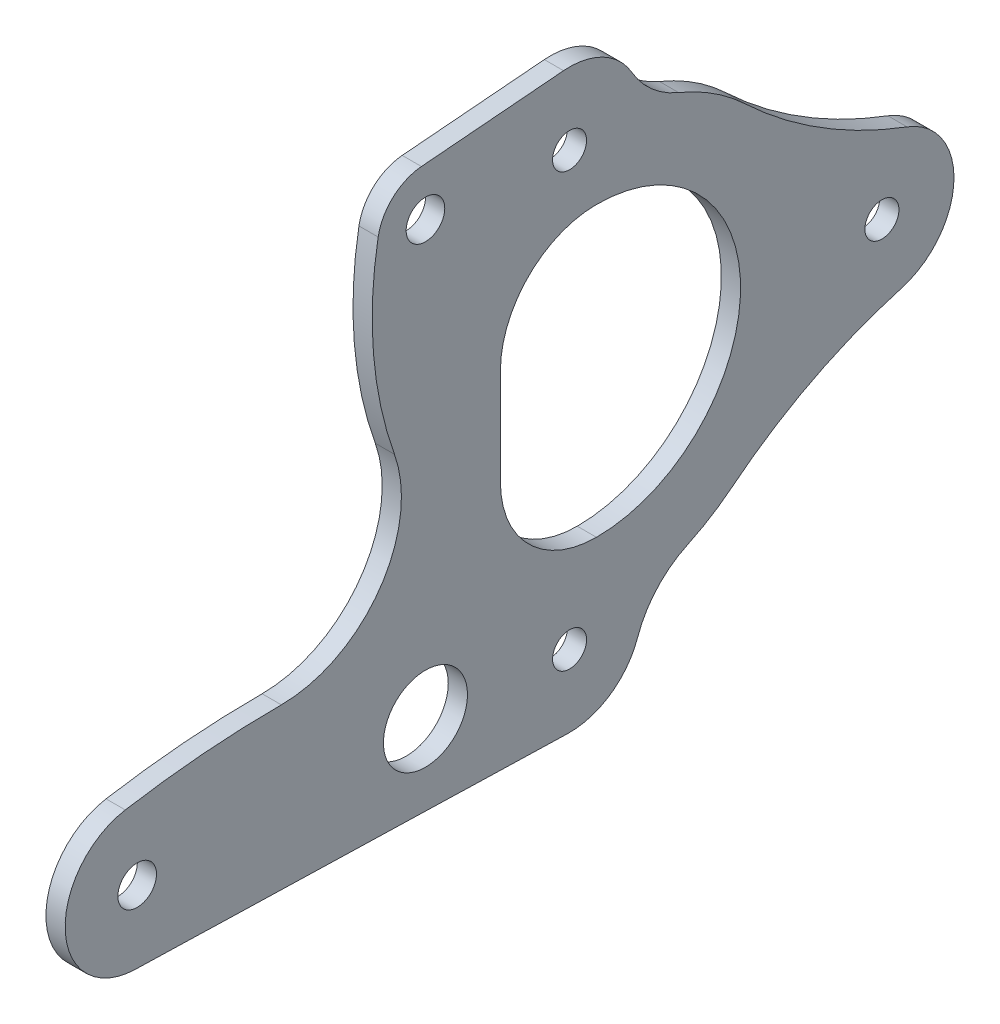
ISO-10303-21;
HEADER;
FILE_DESCRIPTION(('STEP AP214'),'2;1');
FILE_NAME('part.step','',(''),(''),'','','');
FILE_SCHEMA(('AUTOMOTIVE_DESIGN { 1 0 10303 214 1 1 1 1 }'));
ENDSEC;
DATA;
#1=APPLICATION_CONTEXT('core data for automotive mechanical design processes');
#2=APPLICATION_PROTOCOL_DEFINITION('international standard','automotive_design',2000,#1);
#3=PRODUCT_CONTEXT('',#1,'mechanical');
#4=PRODUCT('Part','Part','',(#3));
#5=PRODUCT_RELATED_PRODUCT_CATEGORY('part','',(#4));
#6=PRODUCT_DEFINITION_FORMATION('','',#4);
#7=PRODUCT_DEFINITION_CONTEXT('part definition',#1,'design');
#8=PRODUCT_DEFINITION('design','',#6,#7);
#9=PRODUCT_DEFINITION_SHAPE('','',#8);
#10=(LENGTH_UNIT() NAMED_UNIT(*) SI_UNIT(.MILLI.,.METRE.));
#11=(NAMED_UNIT(*) PLANE_ANGLE_UNIT() SI_UNIT($,.RADIAN.));
#12=(NAMED_UNIT(*) SI_UNIT($,.STERADIAN.) SOLID_ANGLE_UNIT());
#13=UNCERTAINTY_MEASURE_WITH_UNIT(LENGTH_MEASURE(1.E-05),#10,'distance_accuracy_value','');
#14=(GEOMETRIC_REPRESENTATION_CONTEXT(3) GLOBAL_UNCERTAINTY_ASSIGNED_CONTEXT((#13)) GLOBAL_UNIT_ASSIGNED_CONTEXT((#10,
#11,#12)) REPRESENTATION_CONTEXT('',''));
#15=CARTESIAN_POINT('',(0.,0.,0.));
#16=DIRECTION('',(0.,0.,1.));
#17=DIRECTION('',(1.,0.,0.));
#18=AXIS2_PLACEMENT_3D('',#15,#16,#17);
#19=CARTESIAN_POINT('',(2.54,34.6918454316571,2.91131096708449));
#20=DIRECTION('',(0.,0.996497276168665,0.0836252269858301));
#21=DIRECTION('',(0.,-0.0836252269858301,0.996497276168665));
#22=AXIS2_PLACEMENT_3D('',#19,#20,#21);
#23=PLANE('',#22);
#24=DIRECTION('',(0.,0.0836252269858301,-0.996497276168665));
#25=VECTOR('',#24,1.);
#26=CARTESIAN_POINT('',(0.,34.6918454316571,2.91131096708449));
#27=LINE('',#26,#25);
#28=CARTESIAN_POINT('',(0.,36.4902577036732,-18.51897980864));
#29=VERTEX_POINT('',#28);
#30=CARTESIAN_POINT('',(0.,38.0666365555065,-37.30346971296));
#31=VERTEX_POINT('',#30);
#32=EDGE_CURVE('E279',#29,#31,#27,.T.);
#33=ORIENTED_EDGE('',*,*,#32,.F.);
#34=DIRECTION('',(-1.,0.,0.));
#35=VECTOR('',#34,1.);
#36=CARTESIAN_POINT('',(2.54,36.4902577036732,-18.51897980864));
#37=LINE('',#36,#35);
#38=CARTESIAN_POINT('',(2.54,36.4902577036732,-18.51897980864));
#39=VERTEX_POINT('',#38);
#40=EDGE_CURVE('E11',#39,#29,#37,.T.);
#41=ORIENTED_EDGE('',*,*,#40,.F.);
#42=DIRECTION('',(0.,0.0836252269858301,-0.996497276168665));
#43=VECTOR('',#42,1.);
#44=CARTESIAN_POINT('',(2.54,34.6918454316571,2.91131096708449));
#45=LINE('',#44,#43);
#46=CARTESIAN_POINT('',(2.54,38.0666365555065,-37.30346971296));
#47=VERTEX_POINT('',#46);
#48=EDGE_CURVE('E413',#39,#47,#45,.T.);
#49=ORIENTED_EDGE('',*,*,#48,.T.);
#50=DIRECTION('',(-1.,0.,0.));
#51=VECTOR('',#50,1.);
#52=CARTESIAN_POINT('',(2.54,38.0666365555065,-37.30346971296));
#53=LINE('',#52,#51);
#54=EDGE_CURVE('E156',#47,#31,#53,.T.);
#55=ORIENTED_EDGE('',*,*,#54,.T.);
#56=EDGE_LOOP('',(#33,#41,#49,#55));
#57=FACE_BOUND('',#56,.T.);
#58=ADVANCED_FACE('F43',(#57),#23,.T.);
#59=CARTESIAN_POINT('',(2.54,30.1625000000022,-19.0500000000001));
#60=DIRECTION('',(-1.,0.,0.));
#61=DIRECTION('',(0.,0.,1.));
#62=AXIS2_PLACEMENT_3D('',#59,#60,#61);
#63=CYLINDRICAL_SURFACE('',#62,6.34999999999999);
#64=CARTESIAN_POINT('',(0.,30.1625000000022,-19.0500000000001));
#65=DIRECTION('',(1.,0.,0.));
#66=DIRECTION('',(0.,0.,-1.));
#67=AXIS2_PLACEMENT_3D('',#64,#65,#66);
#68=CIRCLE('',#67,6.34999999999999);
#69=CARTESIAN_POINT('',(0.,31.2760569327223,-12.7984009279553));
#70=VERTEX_POINT('',#69);
#71=EDGE_CURVE('E283',#29,#70,#68,.T.);
#72=ORIENTED_EDGE('',*,*,#71,.T.);
#73=DIRECTION('',(-1.,0.,0.));
#74=VECTOR('',#73,1.);
#75=CARTESIAN_POINT('',(2.54,31.2760569327223,-12.7984009279553));
#76=LINE('',#75,#74);
#77=CARTESIAN_POINT('',(2.54,31.2760569327223,-12.7984009279553));
#78=VERTEX_POINT('',#77);
#79=EDGE_CURVE('E54',#78,#70,#76,.T.);
#80=ORIENTED_EDGE('',*,*,#79,.F.);
#81=CARTESIAN_POINT('',(2.54,30.1625000000022,-19.0500000000001));
#82=DIRECTION('',(1.,0.,0.));
#83=DIRECTION('',(0.,0.,-1.));
#84=AXIS2_PLACEMENT_3D('',#81,#82,#83);
#85=CIRCLE('',#84,6.34999999999999);
#86=EDGE_CURVE('E422',#39,#78,#85,.T.);
#87=ORIENTED_EDGE('',*,*,#86,.F.);
#88=ORIENTED_EDGE('',*,*,#40,.T.);
#89=EDGE_LOOP('',(#72,#80,#87,#88));
#90=FACE_BOUND('',#89,.T.);
#91=ADVANCED_FACE('F474',(#90),#63,.T.);
#92=CARTESIAN_POINT('',(2.54,22.3676014709615,-62.8111935043134));
#93=DIRECTION('',(-1.,0.,0.));
#94=DIRECTION('',(0.,0.,1.));
#95=AXIS2_PLACEMENT_3D('',#92,#93,#94);
#96=CYLINDRICAL_SURFACE('',#95,50.8);
#97=CARTESIAN_POINT('',(0.,22.3676014709615,-62.8111935043134));
#98=DIRECTION('',(1.,0.,0.));
#99=DIRECTION('',(0.,0.,-1.));
#100=AXIS2_PLACEMENT_3D('',#97,#98,#99);
#101=CIRCLE('',#100,50.8);
#102=CARTESIAN_POINT('',(0.,5.32561939784772,-14.9550460724561));
#103=VERTEX_POINT('',#102);
#104=EDGE_CURVE('E287',#70,#103,#101,.T.);
#105=ORIENTED_EDGE('',*,*,#104,.T.);
#106=DIRECTION('',(-1.,0.,0.));
#107=VECTOR('',#106,1.);
#108=CARTESIAN_POINT('',(2.54,5.32561939784772,-14.9550460724561));
#109=LINE('',#108,#107);
#110=CARTESIAN_POINT('',(2.54,5.32561939784772,-14.9550460724561));
#111=VERTEX_POINT('',#110);
#112=EDGE_CURVE('E374',#111,#103,#109,.T.);
#113=ORIENTED_EDGE('',*,*,#112,.F.);
#114=CARTESIAN_POINT('',(2.54,22.3676014709615,-62.8111935043134));
#115=DIRECTION('',(1.,0.,0.));
#116=DIRECTION('',(0.,0.,-1.));
#117=AXIS2_PLACEMENT_3D('',#114,#115,#116);
#118=CIRCLE('',#117,50.8);
#119=EDGE_CURVE('E426',#78,#111,#118,.T.);
#120=ORIENTED_EDGE('',*,*,#119,.F.);
#121=ORIENTED_EDGE('',*,*,#79,.T.);
#122=EDGE_LOOP('',(#105,#113,#120,#121));
#123=FACE_BOUND('',#122,.T.);
#124=ADVANCED_FACE('F476',(#123),#96,.T.);
#125=CARTESIAN_POINT('',(2.54,0.,0.));
#126=DIRECTION('',(-1.,0.,0.));
#127=DIRECTION('',(0.,0.,1.));
#128=AXIS2_PLACEMENT_3D('',#125,#126,#127);
#129=CYLINDRICAL_SURFACE('',#128,15.8750000000005);
#130=CARTESIAN_POINT('',(0.,0.,0.));
#131=DIRECTION('',(1.,0.,0.));
#132=DIRECTION('',(0.,0.,-1.));
#133=AXIS2_PLACEMENT_3D('',#130,#131,#132);
#134=CIRCLE('',#133,15.8750000000005);
#135=CARTESIAN_POINT('',(0.,-15.8750000000004,0.));
#136=VERTEX_POINT('',#135);
#137=EDGE_CURVE('E291',#136,#103,#134,.T.);
#138=ORIENTED_EDGE('',*,*,#137,.F.);
#139=DIRECTION('',(-1.,0.,0.));
#140=VECTOR('',#139,1.);
#141=CARTESIAN_POINT('',(2.54,-15.8750000000004,0.));
#142=LINE('',#141,#140);
#143=CARTESIAN_POINT('',(2.54,-15.8750000000004,0.));
#144=VERTEX_POINT('',#143);
#145=EDGE_CURVE('E371',#144,#136,#142,.T.);
#146=ORIENTED_EDGE('',*,*,#145,.F.);
#147=CARTESIAN_POINT('',(2.54,0.,0.));
#148=DIRECTION('',(1.,0.,0.));
#149=DIRECTION('',(0.,0.,-1.));
#150=AXIS2_PLACEMENT_3D('',#147,#148,#149);
#151=CIRCLE('',#150,15.8750000000005);
#152=EDGE_CURVE('E429',#144,#111,#151,.T.);
#153=ORIENTED_EDGE('',*,*,#152,.T.);
#154=ORIENTED_EDGE('',*,*,#112,.T.);
#155=EDGE_LOOP('',(#138,#146,#153,#154));
#156=FACE_BOUND('',#155,.T.);
#157=ADVANCED_FACE('F479',(#156),#129,.F.);
#158=CARTESIAN_POINT('',(2.54,-140.493750000121,4.99340152559924E-12));
#159=DIRECTION('',(-1.,0.,0.));
#160=DIRECTION('',(0.,0.,1.));
#161=AXIS2_PLACEMENT_3D('',#158,#159,#160);
#162=CYLINDRICAL_SURFACE('',#161,124.61875000012);
#163=CARTESIAN_POINT('',(0.,-140.493750000121,4.99340152559924E-12));
#164=DIRECTION('',(1.,0.,0.));
#165=DIRECTION('',(0.,0.,-1.));
#166=AXIS2_PLACEMENT_3D('',#163,#164,#165);
#167=CIRCLE('',#166,124.61875000012);
#168=CARTESIAN_POINT('',(0.,-17.5938793103423,20.6265517241358));
#169=VERTEX_POINT('',#168);
#170=EDGE_CURVE('E295',#136,#169,#167,.T.);
#171=ORIENTED_EDGE('',*,*,#170,.T.);
#172=DIRECTION('',(-1.,0.,0.));
#173=VECTOR('',#172,1.);
#174=CARTESIAN_POINT('',(2.54,-17.5938793103423,20.6265517241358));
#175=LINE('',#174,#173);
#176=CARTESIAN_POINT('',(2.54,-17.5938793103423,20.6265517241358));
#177=VERTEX_POINT('',#176);
#178=EDGE_CURVE('E367',#177,#169,#175,.T.);
#179=ORIENTED_EDGE('',*,*,#178,.F.);
#180=CARTESIAN_POINT('',(2.54,-140.493750000121,4.99340152559924E-12));
#181=DIRECTION('',(1.,0.,0.));
#182=DIRECTION('',(0.,0.,-1.));
#183=AXIS2_PLACEMENT_3D('',#180,#181,#182);
#184=CIRCLE('',#183,124.61875000012);
#185=EDGE_CURVE('E433',#144,#177,#184,.T.);
#186=ORIENTED_EDGE('',*,*,#185,.F.);
#187=ORIENTED_EDGE('',*,*,#145,.T.);
#188=EDGE_LOOP('',(#171,#179,#186,#187));
#189=FACE_BOUND('',#188,.T.);
#190=ADVANCED_FACE('F484',(#189),#162,.T.);
#191=CARTESIAN_POINT('',(2.54,-26.9874999999978,19.0499999999999));
#192=DIRECTION('',(-1.,0.,0.));
#193=DIRECTION('',(0.,0.,1.));
#194=AXIS2_PLACEMENT_3D('',#191,#192,#193);
#195=CYLINDRICAL_SURFACE('',#194,9.52500000000002);
#196=CARTESIAN_POINT('',(0.,-26.9874999999978,19.0499999999999));
#197=DIRECTION('',(1.,0.,0.));
#198=DIRECTION('',(0.,0.,-1.));
#199=AXIS2_PLACEMENT_3D('',#196,#197,#198);
#200=CIRCLE('',#199,9.52500000000002);
#201=CARTESIAN_POINT('',(0.,-36.508827356715,19.3144813154647));
#202=VERTEX_POINT('',#201);
#203=EDGE_CURVE('E299',#169,#202,#200,.T.);
#204=ORIENTED_EDGE('',*,*,#203,.T.);
#205=DIRECTION('',(-1.,0.,0.));
#206=VECTOR('',#205,1.);
#207=CARTESIAN_POINT('',(2.54,-36.508827356715,19.3144813154647));
#208=LINE('',#207,#206);
#209=CARTESIAN_POINT('',(2.54,-36.508827356715,19.3144813154647));
#210=VERTEX_POINT('',#209);
#211=EDGE_CURVE('E363',#210,#202,#208,.T.);
#212=ORIENTED_EDGE('',*,*,#211,.F.);
#213=CARTESIAN_POINT('',(2.54,-26.9874999999978,19.0499999999999));
#214=DIRECTION('',(1.,0.,0.));
#215=DIRECTION('',(0.,0.,-1.));
#216=AXIS2_PLACEMENT_3D('',#213,#214,#215);
#217=CIRCLE('',#216,9.52500000000002);
#218=EDGE_CURVE('E437',#177,#210,#217,.T.);
#219=ORIENTED_EDGE('',*,*,#218,.F.);
#220=ORIENTED_EDGE('',*,*,#178,.T.);
#221=EDGE_LOOP('',(#204,#212,#219,#220));
#222=FACE_BOUND('',#221,.T.);
#223=ADVANCED_FACE('F487',(#222),#195,.T.);
#224=CARTESIAN_POINT('',(2.54,-37.0167783975792,1.0282438443786));
#225=DIRECTION('',(0.,0.999614420652717,-0.027767067240391));
#226=DIRECTION('',(0.,0.027767067240391,0.999614420652717));
#227=AXIS2_PLACEMENT_3D('',#224,#225,#226);
#228=PLANE('',#227);
#229=DIRECTION('',(0.,-0.027767067240391,-0.999614420652717));
#230=VECTOR('',#229,1.);
#231=CARTESIAN_POINT('',(0.,-37.0167783975792,1.0282438443786));
#232=LINE('',#231,#230);
#233=CARTESIAN_POINT('',(0.,-38.0963273567171,-37.8355186845353));
#234=VERTEX_POINT('',#233);
#235=EDGE_CURVE('E303',#202,#234,#232,.T.);
#236=ORIENTED_EDGE('',*,*,#235,.T.);
#237=DIRECTION('',(-1.,0.,0.));
#238=VECTOR('',#237,1.);
#239=CARTESIAN_POINT('',(2.54,-38.0963273567171,-37.8355186845353));
#240=LINE('',#239,#238);
#241=CARTESIAN_POINT('',(2.54,-38.0963273567171,-37.8355186845353));
#242=VERTEX_POINT('',#241);
#243=EDGE_CURVE('E359',#242,#234,#240,.T.);
#244=ORIENTED_EDGE('',*,*,#243,.F.);
#245=DIRECTION('',(0.,-0.027767067240391,-0.999614420652717));
#246=VECTOR('',#245,1.);
#247=CARTESIAN_POINT('',(2.54,-37.0167783975792,1.0282438443786));
#248=LINE('',#247,#246);
#249=EDGE_CURVE('E441',#210,#242,#248,.T.);
#250=ORIENTED_EDGE('',*,*,#249,.F.);
#251=ORIENTED_EDGE('',*,*,#211,.T.);
#252=EDGE_LOOP('',(#236,#244,#250,#251));
#253=FACE_BOUND('',#252,.T.);
#254=ADVANCED_FACE('F489',(#253),#228,.F.);
#255=CARTESIAN_POINT('',(2.54,-28.575,-38.1));
#256=DIRECTION('',(-1.,0.,0.));
#257=DIRECTION('',(0.,0.,1.));
#258=AXIS2_PLACEMENT_3D('',#255,#256,#257);
#259=CYLINDRICAL_SURFACE('',#258,9.52499999999998);
#260=CARTESIAN_POINT('',(0.,-28.575,-38.1));
#261=DIRECTION('',(1.,0.,0.));
#262=DIRECTION('',(0.,0.,-1.));
#263=AXIS2_PLACEMENT_3D('',#260,#261,#262);
#264=CIRCLE('',#263,9.52499999999998);
#265=CARTESIAN_POINT('',(0.,-31.7099252863812,-47.0943242352501));
#266=VERTEX_POINT('',#265);
#267=EDGE_CURVE('E307',#234,#266,#264,.T.);
#268=ORIENTED_EDGE('',*,*,#267,.T.);
#269=DIRECTION('',(-1.,0.,0.));
#270=VECTOR('',#269,1.);
#271=CARTESIAN_POINT('',(2.54,-31.7099252863812,-47.0943242352501));
#272=LINE('',#271,#270);
#273=CARTESIAN_POINT('',(2.54,-31.7099252863812,-47.0943242352501));
#274=VERTEX_POINT('',#273);
#275=EDGE_CURVE('E356',#274,#266,#272,.T.);
#276=ORIENTED_EDGE('',*,*,#275,.F.);
#277=CARTESIAN_POINT('',(2.54,-28.575,-38.1));
#278=DIRECTION('',(1.,0.,0.));
#279=DIRECTION('',(0.,0.,-1.));
#280=AXIS2_PLACEMENT_3D('',#277,#278,#279);
#281=CIRCLE('',#280,9.52499999999998);
#282=EDGE_CURVE('E445',#242,#274,#281,.T.);
#283=ORIENTED_EDGE('',*,*,#282,.F.);
#284=ORIENTED_EDGE('',*,*,#243,.T.);
#285=EDGE_LOOP('',(#268,#276,#283,#284));
#286=FACE_BOUND('',#285,.T.);
#287=ADVANCED_FACE('F494',(#286),#259,.T.);
#288=CARTESIAN_POINT('',(2.54,-35.8898256682227,-59.086756548917));
#289=DIRECTION('',(-1.,0.,0.));
#290=DIRECTION('',(0.,0.,1.));
#291=AXIS2_PLACEMENT_3D('',#288,#289,#290);
#292=CYLINDRICAL_SURFACE('',#291,12.7);
#293=CARTESIAN_POINT('',(0.,-35.8898256682227,-59.086756548917));
#294=DIRECTION('',(1.,0.,0.));
#295=DIRECTION('',(0.,0.,-1.));
#296=AXIS2_PLACEMENT_3D('',#293,#294,#295);
#297=CIRCLE('',#296,12.7);
#298=CARTESIAN_POINT('',(0.,-24.3778793087686,-53.7234468415579));
#299=VERTEX_POINT('',#298);
#300=EDGE_CURVE('E311',#299,#266,#297,.T.);
#301=ORIENTED_EDGE('',*,*,#300,.F.);
#302=DIRECTION('',(-1.,0.,0.));
#303=VECTOR('',#302,1.);
#304=CARTESIAN_POINT('',(2.54,-24.3778793087686,-53.7234468415579));
#305=LINE('',#304,#303);
#306=CARTESIAN_POINT('',(2.54,-24.3778793087686,-53.7234468415579));
#307=VERTEX_POINT('',#306);
#308=EDGE_CURVE('E353',#307,#299,#305,.T.);
#309=ORIENTED_EDGE('',*,*,#308,.F.);
#310=CARTESIAN_POINT('',(2.54,-35.8898256682227,-59.086756548917));
#311=DIRECTION('',(1.,0.,0.));
#312=DIRECTION('',(0.,0.,-1.));
#313=AXIS2_PLACEMENT_3D('',#310,#311,#312);
#314=CIRCLE('',#313,12.7);
#315=EDGE_CURVE('E448',#307,#274,#314,.T.);
#316=ORIENTED_EDGE('',*,*,#315,.T.);
#317=ORIENTED_EDGE('',*,*,#275,.T.);
#318=EDGE_LOOP('',(#301,#309,#316,#317));
#319=FACE_BOUND('',#318,.T.);
#320=ADVANCED_FACE('F497',(#319),#292,.F.);
#321=CARTESIAN_POINT('',(2.54,1.5240000000031,-41.6560000000001));
#322=DIRECTION('',(-1.,0.,0.));
#323=DIRECTION('',(0.,0.,1.));
#324=AXIS2_PLACEMENT_3D('',#321,#322,#323);
#325=CYLINDRICAL_SURFACE('',#324,28.575);
#326=CARTESIAN_POINT('',(0.,1.5240000000031,-41.6560000000001));
#327=DIRECTION('',(1.,0.,0.));
#328=DIRECTION('',(0.,0.,-1.));
#329=AXIS2_PLACEMENT_3D('',#326,#327,#328);
#330=CIRCLE('',#329,28.575);
#331=CARTESIAN_POINT('',(0.,-20.7503137231824,-59.5553176730599));
#332=VERTEX_POINT('',#331);
#333=EDGE_CURVE('E315',#299,#332,#330,.T.);
#334=ORIENTED_EDGE('',*,*,#333,.T.);
#335=DIRECTION('',(-1.,0.,0.));
#336=VECTOR('',#335,1.);
#337=CARTESIAN_POINT('',(2.54,-20.7503137231824,-59.5553176730599));
#338=LINE('',#337,#336);
#339=CARTESIAN_POINT('',(2.54,-20.7503137231824,-59.5553176730599));
#340=VERTEX_POINT('',#339);
#341=EDGE_CURVE('E350',#340,#332,#338,.T.);
#342=ORIENTED_EDGE('',*,*,#341,.F.);
#343=CARTESIAN_POINT('',(2.54,1.5240000000031,-41.6560000000001));
#344=DIRECTION('',(1.,0.,0.));
#345=DIRECTION('',(0.,0.,-1.));
#346=AXIS2_PLACEMENT_3D('',#343,#344,#345);
#347=CIRCLE('',#346,28.575);
#348=EDGE_CURVE('E452',#307,#340,#347,.T.);
#349=ORIENTED_EDGE('',*,*,#348,.F.);
#350=ORIENTED_EDGE('',*,*,#308,.T.);
#351=EDGE_LOOP('',(#334,#342,#349,#350));
#352=FACE_BOUND('',#351,.T.);
#353=ADVANCED_FACE('F502',(#352),#325,.T.);
#354=CARTESIAN_POINT('',(2.54,-70.2487886635945,-99.3315791687485));
#355=DIRECTION('',(-1.,0.,0.));
#356=DIRECTION('',(0.,0.,1.));
#357=AXIS2_PLACEMENT_3D('',#354,#355,#356);
#358=CYLINDRICAL_SURFACE('',#357,63.5);
#359=CARTESIAN_POINT('',(0.,-70.2487886635945,-99.3315791687485));
#360=DIRECTION('',(1.,0.,0.));
#361=DIRECTION('',(0.,0.,-1.));
#362=AXIS2_PLACEMENT_3D('',#359,#360,#361);
#363=CIRCLE('',#362,63.5);
#364=CARTESIAN_POINT('',(0.,-9.16288547786013,-81.9890755437497));
#365=VERTEX_POINT('',#364);
#366=EDGE_CURVE('E319',#365,#332,#363,.T.);
#367=ORIENTED_EDGE('',*,*,#366,.F.);
#368=DIRECTION('',(-1.,0.,0.));
#369=VECTOR('',#368,1.);
#370=CARTESIAN_POINT('',(2.54,-9.16288547786013,-81.9890755437497));
#371=LINE('',#370,#369);
#372=CARTESIAN_POINT('',(2.54,-9.16288547786013,-81.9890755437497));
#373=VERTEX_POINT('',#372);
#374=EDGE_CURVE('E347',#373,#365,#371,.T.);
#375=ORIENTED_EDGE('',*,*,#374,.F.);
#376=CARTESIAN_POINT('',(2.54,-70.2487886635945,-99.3315791687485));
#377=DIRECTION('',(1.,0.,0.));
#378=DIRECTION('',(0.,0.,-1.));
#379=AXIS2_PLACEMENT_3D('',#376,#377,#378);
#380=CIRCLE('',#379,63.5);
#381=EDGE_CURVE('E455',#373,#340,#380,.T.);
#382=ORIENTED_EDGE('',*,*,#381,.T.);
#383=ORIENTED_EDGE('',*,*,#341,.T.);
#384=EDGE_LOOP('',(#367,#375,#382,#383));
#385=FACE_BOUND('',#384,.T.);
#386=ADVANCED_FACE('F507',(#385),#358,.F.);
#387=CARTESIAN_POINT('',(2.54,0.,-79.3876999999999));
#388=DIRECTION('',(-1.,0.,0.));
#389=DIRECTION('',(0.,0.,1.));
#390=AXIS2_PLACEMENT_3D('',#387,#388,#389);
#391=CYLINDRICAL_SURFACE('',#390,9.52499999999997);
#392=CARTESIAN_POINT('',(0.,0.,-79.3876999999999));
#393=DIRECTION('',(1.,0.,0.));
#394=DIRECTION('',(0.,0.,-1.));
#395=AXIS2_PLACEMENT_3D('',#392,#393,#394);
#396=CIRCLE('',#395,9.52499999999997);
#397=CARTESIAN_POINT('',(0.,8.92323858671863,-82.7195820694158));
#398=VERTEX_POINT('',#397);
#399=EDGE_CURVE('E323',#365,#398,#396,.T.);
#400=ORIENTED_EDGE('',*,*,#399,.T.);
#401=DIRECTION('',(-1.,0.,0.));
#402=VECTOR('',#401,1.);
#403=CARTESIAN_POINT('',(2.54,8.92323858671863,-82.7195820694158));
#404=LINE('',#403,#402);
#405=CARTESIAN_POINT('',(2.54,8.92323858671863,-82.7195820694158));
#406=VERTEX_POINT('',#405);
#407=EDGE_CURVE('E344',#406,#398,#404,.T.);
#408=ORIENTED_EDGE('',*,*,#407,.F.);
#409=CARTESIAN_POINT('',(2.54,0.,-79.3876999999999));
#410=DIRECTION('',(1.,0.,0.));
#411=DIRECTION('',(0.,0.,-1.));
#412=AXIS2_PLACEMENT_3D('',#409,#410,#411);
#413=CIRCLE('',#412,9.52499999999997);
#414=EDGE_CURVE('E459',#373,#406,#413,.T.);
#415=ORIENTED_EDGE('',*,*,#414,.F.);
#416=ORIENTED_EDGE('',*,*,#374,.T.);
#417=EDGE_LOOP('',(#400,#408,#415,#416));
#418=FACE_BOUND('',#417,.T.);
#419=ADVANCED_FACE('F509',(#418),#391,.T.);
#420=CARTESIAN_POINT('',(2.54,68.4114958315097,-104.932129198855));
#421=DIRECTION('',(-1.,0.,0.));
#422=DIRECTION('',(0.,0.,1.));
#423=AXIS2_PLACEMENT_3D('',#420,#421,#422);
#424=CYLINDRICAL_SURFACE('',#423,63.5);
#425=CARTESIAN_POINT('',(0.,68.4114958315097,-104.932129198855));
#426=DIRECTION('',(1.,0.,0.));
#427=DIRECTION('',(0.,0.,-1.));
#428=AXIS2_PLACEMENT_3D('',#425,#426,#427);
#429=CIRCLE('',#428,63.5);
#430=CARTESIAN_POINT('',(0.,22.2821883615052,-61.2934194065412));
#431=VERTEX_POINT('',#430);
#432=EDGE_CURVE('E327',#431,#398,#429,.T.);
#433=ORIENTED_EDGE('',*,*,#432,.F.);
#434=DIRECTION('',(-1.,0.,0.));
#435=VECTOR('',#434,1.);
#436=CARTESIAN_POINT('',(2.54,22.2821883615052,-61.2934194065412));
#437=LINE('',#436,#435);
#438=CARTESIAN_POINT('',(2.54,22.2821883615052,-61.2934194065412));
#439=VERTEX_POINT('',#438);
#440=EDGE_CURVE('E250',#439,#431,#437,.T.);
#441=ORIENTED_EDGE('',*,*,#440,.F.);
#442=CARTESIAN_POINT('',(2.54,68.4114958315097,-104.932129198855));
#443=DIRECTION('',(1.,0.,0.));
#444=DIRECTION('',(0.,0.,-1.));
#445=AXIS2_PLACEMENT_3D('',#442,#443,#444);
#446=CIRCLE('',#445,63.5);
#447=EDGE_CURVE('E237',#439,#406,#446,.T.);
#448=ORIENTED_EDGE('',*,*,#447,.T.);
#449=ORIENTED_EDGE('',*,*,#407,.T.);
#450=EDGE_LOOP('',(#433,#441,#448,#449));
#451=FACE_BOUND('',#450,.T.);
#452=ADVANCED_FACE('F464',(#451),#424,.F.);
#453=CARTESIAN_POINT('',(2.54,1.5240000000031,-41.6560000000001));
#454=DIRECTION('',(-1.,0.,0.));
#455=DIRECTION('',(0.,0.,1.));
#456=AXIS2_PLACEMENT_3D('',#453,#454,#455);
#457=CYLINDRICAL_SURFACE('',#456,28.575);
#458=CARTESIAN_POINT('',(0.,1.5240000000031,-41.6560000000001));
#459=DIRECTION('',(1.,0.,0.));
#460=DIRECTION('',(0.,0.,-1.));
#461=AXIS2_PLACEMENT_3D('',#458,#459,#460);
#462=CIRCLE('',#461,28.575);
#463=CARTESIAN_POINT('',(0.,27.9562113626633,-52.5127411077017));
#464=VERTEX_POINT('',#463);
#465=EDGE_CURVE('E245',#431,#464,#462,.T.);
#466=ORIENTED_EDGE('',*,*,#465,.T.);
#467=DIRECTION('',(-1.,0.,0.));
#468=VECTOR('',#467,1.);
#469=CARTESIAN_POINT('',(2.54,27.9562113626633,-52.5127411077017));
#470=LINE('',#469,#468);
#471=CARTESIAN_POINT('',(2.54,27.9562113626633,-52.5127411077017));
#472=VERTEX_POINT('',#471);
#473=EDGE_CURVE('E242',#472,#464,#470,.T.);
#474=ORIENTED_EDGE('',*,*,#473,.F.);
#475=CARTESIAN_POINT('',(2.54,1.5240000000031,-41.6560000000001));
#476=DIRECTION('',(1.,0.,0.));
#477=DIRECTION('',(0.,0.,-1.));
#478=AXIS2_PLACEMENT_3D('',#475,#476,#477);
#479=CIRCLE('',#478,28.575);
#480=EDGE_CURVE('E231',#439,#472,#479,.T.);
#481=ORIENTED_EDGE('',*,*,#480,.F.);
#482=ORIENTED_EDGE('',*,*,#440,.T.);
#483=EDGE_LOOP('',(#466,#474,#481,#482));
#484=FACE_BOUND('',#483,.T.);
#485=ADVANCED_FACE('F243',(#484),#457,.T.);
#486=CARTESIAN_POINT('',(2.54,39.7038608571789,-57.3379593777913));
#487=DIRECTION('',(-1.,0.,0.));
#488=DIRECTION('',(0.,0.,1.));
#489=AXIS2_PLACEMENT_3D('',#486,#487,#488);
#490=CYLINDRICAL_SURFACE('',#489,12.7);
#491=CARTESIAN_POINT('',(0.,39.7038608571789,-57.3379593777913));
#492=DIRECTION('',(1.,0.,0.));
#493=DIRECTION('',(0.,0.,-1.));
#494=AXIS2_PLACEMENT_3D('',#491,#492,#493);
#495=CIRCLE('',#494,12.7);
#496=CARTESIAN_POINT('',(0.,33.3445117959338,-46.3448397333391));
#497=VERTEX_POINT('',#496);
#498=EDGE_CURVE('E333',#497,#464,#495,.T.);
#499=ORIENTED_EDGE('',*,*,#498,.F.);
#500=DIRECTION('',(-1.,0.,0.));
#501=VECTOR('',#500,1.);
#502=CARTESIAN_POINT('',(2.54,33.3445117959338,-46.3448397333391));
#503=LINE('',#502,#501);
#504=CARTESIAN_POINT('',(2.54,33.3445117959338,-46.3448397333391));
#505=VERTEX_POINT('',#504);
#506=EDGE_CURVE('E149',#505,#497,#503,.T.);
#507=ORIENTED_EDGE('',*,*,#506,.F.);
#508=CARTESIAN_POINT('',(2.54,39.7038608571789,-57.3379593777913));
#509=DIRECTION('',(1.,0.,0.));
#510=DIRECTION('',(0.,0.,-1.));
#511=AXIS2_PLACEMENT_3D('',#508,#509,#510);
#512=CIRCLE('',#511,12.7);
#513=EDGE_CURVE('E235',#505,#472,#512,.T.);
#514=ORIENTED_EDGE('',*,*,#513,.T.);
#515=ORIENTED_EDGE('',*,*,#473,.T.);
#516=EDGE_LOOP('',(#499,#507,#514,#515));
#517=FACE_BOUND('',#516,.T.);
#518=ADVANCED_FACE('F252',(#517),#490,.F.);
#519=CARTESIAN_POINT('',(2.54,1.5240000000031,-41.6560000000001));
#520=DIRECTION('',(-1.,0.,0.));
#521=DIRECTION('',(0.,0.,1.));
#522=AXIS2_PLACEMENT_3D('',#519,#520,#521);
#523=CYLINDRICAL_SURFACE('',#522,19.05);
#524=CARTESIAN_POINT('',(0.,1.5240000000031,-41.6560000000001));
#525=DIRECTION('',(1.,0.,0.));
#526=DIRECTION('',(0.,0.,-1.));
#527=AXIS2_PLACEMENT_3D('',#524,#525,#526);
#528=CIRCLE('',#527,19.05);
#529=CARTESIAN_POINT('',(0.,-17.5259999999969,-41.6560000000001));
#530=VERTEX_POINT('',#529);
#531=CARTESIAN_POINT('',(0.,20.5740000000031,-41.6560000000001));
#532=VERTEX_POINT('',#531);
#533=EDGE_CURVE('E262',#530,#532,#528,.T.);
#534=ORIENTED_EDGE('',*,*,#533,.F.);
#535=DIRECTION('',(-1.,0.,0.));
#536=VECTOR('',#535,1.);
#537=CARTESIAN_POINT('',(2.54,-17.5259999999969,-41.6560000000001));
#538=LINE('',#537,#536);
#539=CARTESIAN_POINT('',(2.54,-17.5259999999969,-41.6560000000001));
#540=VERTEX_POINT('',#539);
#541=EDGE_CURVE('E47',#540,#530,#538,.T.);
#542=ORIENTED_EDGE('',*,*,#541,.F.);
#543=CARTESIAN_POINT('',(2.54,1.5240000000031,-41.6560000000001));
#544=DIRECTION('',(1.,0.,0.));
#545=DIRECTION('',(0.,0.,-1.));
#546=AXIS2_PLACEMENT_3D('',#543,#544,#545);
#547=CIRCLE('',#546,19.05);
#548=CARTESIAN_POINT('',(2.54,20.5740000000031,-41.6560000000001));
#549=VERTEX_POINT('',#548);
#550=EDGE_CURVE('E338',#540,#549,#547,.T.);
#551=ORIENTED_EDGE('',*,*,#550,.T.);
#552=DIRECTION('',(-1.,0.,0.));
#553=VECTOR('',#552,1.);
#554=CARTESIAN_POINT('',(2.54,20.5740000000031,-41.6560000000001));
#555=LINE('',#554,#553);
#556=EDGE_CURVE('E258',#549,#532,#555,.T.);
#557=ORIENTED_EDGE('',*,*,#556,.T.);
#558=EDGE_LOOP('',(#534,#542,#551,#557));
#559=FACE_BOUND('',#558,.T.);
#560=ADVANCED_FACE('F45',(#559),#523,.F.);
#561=CARTESIAN_POINT('',(2.54,-4.82599999999691,-41.6560000000001));
#562=DIRECTION('',(-1.,0.,0.));
#563=DIRECTION('',(0.,0.,1.));
#564=AXIS2_PLACEMENT_3D('',#561,#562,#563);
#565=CYLINDRICAL_SURFACE('',#564,12.7);
#566=CARTESIAN_POINT('',(0.,-4.82599999999691,-41.6560000000001));
#567=DIRECTION('',(1.,0.,0.));
#568=DIRECTION('',(0.,0.,-1.));
#569=AXIS2_PLACEMENT_3D('',#566,#567,#568);
#570=CIRCLE('',#569,12.7);
#571=CARTESIAN_POINT('',(0.,-4.82599999999691,-28.9560000000001));
#572=VERTEX_POINT('',#571);
#573=EDGE_CURVE('E266',#530,#572,#570,.F.);
#574=ORIENTED_EDGE('',*,*,#573,.T.);
#575=DIRECTION('',(-1.,0.,0.));
#576=VECTOR('',#575,1.);
#577=CARTESIAN_POINT('',(2.54,-4.82599999999691,-28.9560000000001));
#578=LINE('',#577,#576);
#579=CARTESIAN_POINT('',(2.54,-4.82599999999691,-28.9560000000001));
#580=VERTEX_POINT('',#579);
#581=EDGE_CURVE('E384',#580,#572,#578,.T.);
#582=ORIENTED_EDGE('',*,*,#581,.F.);
#583=CARTESIAN_POINT('',(2.54,-4.82599999999691,-41.6560000000001));
#584=DIRECTION('',(1.,0.,0.));
#585=DIRECTION('',(0.,0.,-1.));
#586=AXIS2_PLACEMENT_3D('',#583,#584,#585);
#587=CIRCLE('',#586,12.7);
#588=EDGE_CURVE('E397',#540,#580,#587,.F.);
#589=ORIENTED_EDGE('',*,*,#588,.F.);
#590=ORIENTED_EDGE('',*,*,#541,.T.);
#591=EDGE_LOOP('',(#574,#582,#589,#590));
#592=FACE_BOUND('',#591,.T.);
#593=ADVANCED_FACE('F396',(#592),#565,.F.);
#594=CARTESIAN_POINT('',(2.54,0.,-28.9560000000001));
#595=DIRECTION('',(0.,0.,-1.));
#596=DIRECTION('',(0.,1.,0.));
#597=AXIS2_PLACEMENT_3D('',#594,#595,#596);
#598=PLANE('',#597);
#599=DIRECTION('',(0.,-1.,0.));
#600=VECTOR('',#599,1.);
#601=CARTESIAN_POINT('',(0.,0.,-28.9560000000001));
#602=LINE('',#601,#600);
#603=CARTESIAN_POINT('',(0.,7.8740000000031,-28.9560000000001));
#604=VERTEX_POINT('',#603);
#605=EDGE_CURVE('E271',#604,#572,#602,.T.);
#606=ORIENTED_EDGE('',*,*,#605,.F.);
#607=DIRECTION('',(-1.,0.,0.));
#608=VECTOR('',#607,1.);
#609=CARTESIAN_POINT('',(2.54,7.8740000000031,-28.9560000000001));
#610=LINE('',#609,#608);
#611=CARTESIAN_POINT('',(2.54,7.8740000000031,-28.9560000000001));
#612=VERTEX_POINT('',#611);
#613=EDGE_CURVE('E382',#612,#604,#610,.T.);
#614=ORIENTED_EDGE('',*,*,#613,.F.);
#615=DIRECTION('',(0.,-1.,0.));
#616=VECTOR('',#615,1.);
#617=CARTESIAN_POINT('',(2.54,0.,-28.9560000000001));
#618=LINE('',#617,#616);
#619=EDGE_CURVE('E409',#612,#580,#618,.T.);
#620=ORIENTED_EDGE('',*,*,#619,.T.);
#621=ORIENTED_EDGE('',*,*,#581,.T.);
#622=EDGE_LOOP('',(#606,#614,#620,#621));
#623=FACE_BOUND('',#622,.T.);
#624=ADVANCED_FACE('F407',(#623),#598,.T.);
#625=CARTESIAN_POINT('',(2.54,7.8740000000031,-41.6560000000001));
#626=DIRECTION('',(-1.,0.,0.));
#627=DIRECTION('',(0.,0.,1.));
#628=AXIS2_PLACEMENT_3D('',#625,#626,#627);
#629=CYLINDRICAL_SURFACE('',#628,12.7);
#630=CARTESIAN_POINT('',(0.,7.8740000000031,-41.6560000000001));
#631=DIRECTION('',(1.,0.,0.));
#632=DIRECTION('',(0.,0.,-1.));
#633=AXIS2_PLACEMENT_3D('',#630,#631,#632);
#634=CIRCLE('',#633,12.7);
#635=EDGE_CURVE('E275',#604,#532,#634,.F.);
#636=ORIENTED_EDGE('',*,*,#635,.T.);
#637=ORIENTED_EDGE('',*,*,#556,.F.);
#638=CARTESIAN_POINT('',(2.54,7.8740000000031,-41.6560000000001));
#639=DIRECTION('',(1.,0.,0.));
#640=DIRECTION('',(0.,0.,-1.));
#641=AXIS2_PLACEMENT_3D('',#638,#639,#640);
#642=CIRCLE('',#641,12.7);
#643=EDGE_CURVE('E410',#612,#549,#642,.F.);
#644=ORIENTED_EDGE('',*,*,#643,.F.);
#645=ORIENTED_EDGE('',*,*,#613,.T.);
#646=EDGE_LOOP('',(#636,#637,#644,#645));
#647=FACE_BOUND('',#646,.T.);
#648=ADVANCED_FACE('F406',(#647),#629,.F.);
#649=CARTESIAN_POINT('',(2.54,28.575,-38.1));
#650=DIRECTION('',(-1.,0.,0.));
#651=DIRECTION('',(0.,0.,1.));
#652=AXIS2_PLACEMENT_3D('',#649,#650,#651);
#653=CYLINDRICAL_SURFACE('',#652,9.52499999999999);
#654=CARTESIAN_POINT('',(0.,28.575,-38.1));
#655=DIRECTION('',(1.,0.,0.));
#656=DIRECTION('',(0.,0.,-1.));
#657=AXIS2_PLACEMENT_3D('',#654,#655,#656);
#658=CIRCLE('',#657,9.52499999999999);
#659=EDGE_CURVE('E335',#497,#31,#658,.T.);
#660=ORIENTED_EDGE('',*,*,#659,.T.);
#661=ORIENTED_EDGE('',*,*,#54,.F.);
#662=CARTESIAN_POINT('',(2.54,28.575,-38.1));
#663=DIRECTION('',(1.,0.,0.));
#664=DIRECTION('',(0.,0.,-1.));
#665=AXIS2_PLACEMENT_3D('',#662,#663,#664);
#666=CIRCLE('',#665,9.52499999999999);
#667=EDGE_CURVE('E66',#505,#47,#666,.T.);
#668=ORIENTED_EDGE('',*,*,#667,.F.);
#669=ORIENTED_EDGE('',*,*,#506,.T.);
#670=EDGE_LOOP('',(#660,#661,#668,#669));
#671=FACE_BOUND('',#670,.T.);
#672=ADVANCED_FACE('F468',(#671),#653,.T.);
#673=CARTESIAN_POINT('',(2.54,0.,0.));
#674=DIRECTION('',(1.,0.,0.));
#675=DIRECTION('',(0.,0.,-1.));
#676=AXIS2_PLACEMENT_3D('',#673,#674,#675);
#677=PLANE('',#676);
#678=CARTESIAN_POINT('',(2.54,-26.9874999999978,19.0499999999999));
#679=DIRECTION('',(1.,0.,0.));
#680=DIRECTION('',(0.,0.,-1.));
#681=AXIS2_PLACEMENT_3D('',#678,#679,#680);
#682=CIRCLE('',#681,2.5527);
#683=CARTESIAN_POINT('',(2.54,-26.9874999999978,16.4972999999999));
#684=VERTEX_POINT('',#683);
#685=EDGE_CURVE('E581',#684,#684,#682,.T.);
#686=ORIENTED_EDGE('',*,*,#685,.F.);
#687=EDGE_LOOP('',(#686));
#688=FACE_BOUND('',#687,.T.);
#689=CARTESIAN_POINT('',(2.54,30.1625000000022,-19.0500000000001));
#690=DIRECTION('',(1.,0.,0.));
#691=DIRECTION('',(0.,0.,-1.));
#692=AXIS2_PLACEMENT_3D('',#689,#690,#691);
#693=CIRCLE('',#692,2.5527);
#694=CARTESIAN_POINT('',(2.54,30.1625000000022,-21.6027000000001));
#695=VERTEX_POINT('',#694);
#696=EDGE_CURVE('E585',#695,#695,#693,.T.);
#697=ORIENTED_EDGE('',*,*,#696,.F.);
#698=EDGE_LOOP('',(#697));
#699=FACE_BOUND('',#698,.T.);
#700=CARTESIAN_POINT('',(2.54,-28.575,-38.1));
#701=DIRECTION('',(1.,0.,0.));
#702=DIRECTION('',(0.,0.,-1.));
#703=AXIS2_PLACEMENT_3D('',#700,#701,#702);
#704=CIRCLE('',#703,2.24789999999999);
#705=CARTESIAN_POINT('',(2.54,-28.575,-40.3479));
#706=VERTEX_POINT('',#705);
#707=EDGE_CURVE('E595',#706,#706,#704,.T.);
#708=ORIENTED_EDGE('',*,*,#707,.F.);
#709=EDGE_LOOP('',(#708));
#710=FACE_BOUND('',#709,.T.);
#711=CARTESIAN_POINT('',(2.54,0.,-79.3876999999999));
#712=DIRECTION('',(1.,0.,0.));
#713=DIRECTION('',(0.,0.,-1.));
#714=AXIS2_PLACEMENT_3D('',#711,#712,#713);
#715=CIRCLE('',#714,2.24789999999999);
#716=CARTESIAN_POINT('',(2.54,0.,-81.6355999999999));
#717=VERTEX_POINT('',#716);
#718=EDGE_CURVE('E603',#717,#717,#715,.T.);
#719=ORIENTED_EDGE('',*,*,#718,.F.);
#720=EDGE_LOOP('',(#719));
#721=FACE_BOUND('',#720,.T.);
#722=CARTESIAN_POINT('',(2.54,28.575,-38.1));
#723=DIRECTION('',(1.,0.,0.));
#724=DIRECTION('',(0.,0.,-1.));
#725=AXIS2_PLACEMENT_3D('',#722,#723,#724);
#726=CIRCLE('',#725,2.24789999999999);
#727=CARTESIAN_POINT('',(2.54,28.575,-40.3479));
#728=VERTEX_POINT('',#727);
#729=EDGE_CURVE('E611',#728,#728,#726,.T.);
#730=ORIENTED_EDGE('',*,*,#729,.F.);
#731=EDGE_LOOP('',(#730));
#732=FACE_BOUND('',#731,.T.);
#733=CARTESIAN_POINT('',(2.54,-26.9874999999978,-19.0500000000001));
#734=DIRECTION('',(1.,0.,0.));
#735=DIRECTION('',(0.,0.,-1.));
#736=AXIS2_PLACEMENT_3D('',#733,#734,#735);
#737=CIRCLE('',#736,5.55625);
#738=CARTESIAN_POINT('',(2.54,-26.9874999999978,-24.6062500000001));
#739=VERTEX_POINT('',#738);
#740=EDGE_CURVE('E619',#739,#739,#737,.T.);
#741=ORIENTED_EDGE('',*,*,#740,.F.);
#742=EDGE_LOOP('',(#741));
#743=FACE_BOUND('',#742,.T.);
#744=ORIENTED_EDGE('',*,*,#550,.F.);
#745=ORIENTED_EDGE('',*,*,#588,.T.);
#746=ORIENTED_EDGE('',*,*,#619,.F.);
#747=ORIENTED_EDGE('',*,*,#643,.T.);
#748=EDGE_LOOP('',(#744,#745,#746,#747));
#749=FACE_BOUND('',#748,.T.);
#750=ORIENTED_EDGE('',*,*,#48,.F.);
#751=ORIENTED_EDGE('',*,*,#86,.T.);
#752=ORIENTED_EDGE('',*,*,#119,.T.);
#753=ORIENTED_EDGE('',*,*,#152,.F.);
#754=ORIENTED_EDGE('',*,*,#185,.T.);
#755=ORIENTED_EDGE('',*,*,#218,.T.);
#756=ORIENTED_EDGE('',*,*,#249,.T.);
#757=ORIENTED_EDGE('',*,*,#282,.T.);
#758=ORIENTED_EDGE('',*,*,#315,.F.);
#759=ORIENTED_EDGE('',*,*,#348,.T.);
#760=ORIENTED_EDGE('',*,*,#381,.F.);
#761=ORIENTED_EDGE('',*,*,#414,.T.);
#762=ORIENTED_EDGE('',*,*,#447,.F.);
#763=ORIENTED_EDGE('',*,*,#480,.T.);
#764=ORIENTED_EDGE('',*,*,#513,.F.);
#765=ORIENTED_EDGE('',*,*,#667,.T.);
#766=EDGE_LOOP('',(#750,#751,#752,#753,#754,#755,#756,#757,#758,#759,#760,#761,#762,#763,#764,#765));
#767=FACE_BOUND('',#766,.T.);
#768=ADVANCED_FACE('F233',(#688,#699,#710,#721,#732,#743,#749,#767),#677,.T.);
#769=CARTESIAN_POINT('',(0.,0.,0.));
#770=DIRECTION('',(1.,0.,0.));
#771=DIRECTION('',(0.,0.,-1.));
#772=AXIS2_PLACEMENT_3D('',#769,#770,#771);
#773=PLANE('',#772);
#774=CARTESIAN_POINT('',(0.,-26.9874999999978,19.0499999999999));
#775=DIRECTION('',(1.,0.,0.));
#776=DIRECTION('',(0.,0.,-1.));
#777=AXIS2_PLACEMENT_3D('',#774,#775,#776);
#778=CIRCLE('',#777,2.5527);
#779=CARTESIAN_POINT('',(0.,-26.9874999999978,16.4972999999999));
#780=VERTEX_POINT('',#779);
#781=EDGE_CURVE('E578',#780,#780,#778,.T.);
#782=ORIENTED_EDGE('',*,*,#781,.T.);
#783=EDGE_LOOP('',(#782));
#784=FACE_BOUND('',#783,.T.);
#785=CARTESIAN_POINT('',(0.,30.1625000000022,-19.0500000000001));
#786=DIRECTION('',(1.,0.,0.));
#787=DIRECTION('',(0.,0.,-1.));
#788=AXIS2_PLACEMENT_3D('',#785,#786,#787);
#789=CIRCLE('',#788,2.5527);
#790=CARTESIAN_POINT('',(0.,30.1625000000022,-21.6027000000001));
#791=VERTEX_POINT('',#790);
#792=EDGE_CURVE('E591',#791,#791,#789,.T.);
#793=ORIENTED_EDGE('',*,*,#792,.T.);
#794=EDGE_LOOP('',(#793));
#795=FACE_BOUND('',#794,.T.);
#796=CARTESIAN_POINT('',(0.,-28.575,-38.1));
#797=DIRECTION('',(1.,0.,0.));
#798=DIRECTION('',(0.,0.,-1.));
#799=AXIS2_PLACEMENT_3D('',#796,#797,#798);
#800=CIRCLE('',#799,2.2479);
#801=CARTESIAN_POINT('',(0.,-28.575,-40.3479));
#802=VERTEX_POINT('',#801);
#803=EDGE_CURVE('E599',#802,#802,#800,.T.);
#804=ORIENTED_EDGE('',*,*,#803,.T.);
#805=EDGE_LOOP('',(#804));
#806=FACE_BOUND('',#805,.T.);
#807=CARTESIAN_POINT('',(0.,0.,-79.3876999999999));
#808=DIRECTION('',(1.,0.,0.));
#809=DIRECTION('',(0.,0.,-1.));
#810=AXIS2_PLACEMENT_3D('',#807,#808,#809);
#811=CIRCLE('',#810,2.2479);
#812=CARTESIAN_POINT('',(0.,0.,-81.6355999999999));
#813=VERTEX_POINT('',#812);
#814=EDGE_CURVE('E607',#813,#813,#811,.T.);
#815=ORIENTED_EDGE('',*,*,#814,.T.);
#816=EDGE_LOOP('',(#815));
#817=FACE_BOUND('',#816,.T.);
#818=CARTESIAN_POINT('',(0.,28.575,-38.1));
#819=DIRECTION('',(1.,0.,0.));
#820=DIRECTION('',(0.,0.,-1.));
#821=AXIS2_PLACEMENT_3D('',#818,#819,#820);
#822=CIRCLE('',#821,2.2479);
#823=CARTESIAN_POINT('',(0.,28.575,-40.3479));
#824=VERTEX_POINT('',#823);
#825=EDGE_CURVE('E615',#824,#824,#822,.T.);
#826=ORIENTED_EDGE('',*,*,#825,.T.);
#827=EDGE_LOOP('',(#826));
#828=FACE_BOUND('',#827,.T.);
#829=CARTESIAN_POINT('',(0.,-26.9874999999978,-19.0500000000001));
#830=DIRECTION('',(1.,0.,0.));
#831=DIRECTION('',(0.,0.,-1.));
#832=AXIS2_PLACEMENT_3D('',#829,#830,#831);
#833=CIRCLE('',#832,5.55625);
#834=CARTESIAN_POINT('',(0.,-26.9874999999978,-24.6062500000001));
#835=VERTEX_POINT('',#834);
#836=EDGE_CURVE('E267',#835,#835,#833,.T.);
#837=ORIENTED_EDGE('',*,*,#836,.T.);
#838=EDGE_LOOP('',(#837));
#839=FACE_BOUND('',#838,.T.);
#840=ORIENTED_EDGE('',*,*,#533,.T.);
#841=ORIENTED_EDGE('',*,*,#635,.F.);
#842=ORIENTED_EDGE('',*,*,#605,.T.);
#843=ORIENTED_EDGE('',*,*,#573,.F.);
#844=EDGE_LOOP('',(#840,#841,#842,#843));
#845=FACE_BOUND('',#844,.T.);
#846=ORIENTED_EDGE('',*,*,#32,.T.);
#847=ORIENTED_EDGE('',*,*,#659,.F.);
#848=ORIENTED_EDGE('',*,*,#498,.T.);
#849=ORIENTED_EDGE('',*,*,#465,.F.);
#850=ORIENTED_EDGE('',*,*,#432,.T.);
#851=ORIENTED_EDGE('',*,*,#399,.F.);
#852=ORIENTED_EDGE('',*,*,#366,.T.);
#853=ORIENTED_EDGE('',*,*,#333,.F.);
#854=ORIENTED_EDGE('',*,*,#300,.T.);
#855=ORIENTED_EDGE('',*,*,#267,.F.);
#856=ORIENTED_EDGE('',*,*,#235,.F.);
#857=ORIENTED_EDGE('',*,*,#203,.F.);
#858=ORIENTED_EDGE('',*,*,#170,.F.);
#859=ORIENTED_EDGE('',*,*,#137,.T.);
#860=ORIENTED_EDGE('',*,*,#104,.F.);
#861=ORIENTED_EDGE('',*,*,#71,.F.);
#862=EDGE_LOOP('',(#846,#847,#848,#849,#850,#851,#852,#853,#854,#855,#856,#857,#858,#859,#860,#861));
#863=FACE_BOUND('',#862,.T.);
#864=ADVANCED_FACE('F400',(#784,#795,#806,#817,#828,#839,#845,#863),#773,.F.);
#865=CARTESIAN_POINT('',(2.54,-26.9874999999978,-19.0500000000001));
#866=DIRECTION('',(1.,0.,0.));
#867=DIRECTION('',(0.,0.,-1.));
#868=AXIS2_PLACEMENT_3D('',#865,#866,#867);
#869=CYLINDRICAL_SURFACE('',#868,5.55625);
#870=ORIENTED_EDGE('',*,*,#836,.F.);
#871=EDGE_LOOP('',(#870));
#872=FACE_BOUND('',#871,.T.);
#873=ORIENTED_EDGE('',*,*,#740,.T.);
#874=EDGE_LOOP('',(#873));
#875=FACE_BOUND('',#874,.T.);
#876=ADVANCED_FACE('F546',(#872,#875),#869,.F.);
#877=CARTESIAN_POINT('',(2.54,28.575,-38.1));
#878=DIRECTION('',(1.,0.,0.));
#879=DIRECTION('',(0.,0.,-1.));
#880=AXIS2_PLACEMENT_3D('',#877,#878,#879);
#881=CYLINDRICAL_SURFACE('',#880,2.24789999999999);
#882=ORIENTED_EDGE('',*,*,#825,.F.);
#883=EDGE_LOOP('',(#882));
#884=FACE_BOUND('',#883,.T.);
#885=ORIENTED_EDGE('',*,*,#729,.T.);
#886=EDGE_LOOP('',(#885));
#887=FACE_BOUND('',#886,.T.);
#888=ADVANCED_FACE('F553',(#884,#887),#881,.F.);
#889=CARTESIAN_POINT('',(2.54,0.,-79.3876999999999));
#890=DIRECTION('',(1.,0.,0.));
#891=DIRECTION('',(0.,0.,-1.));
#892=AXIS2_PLACEMENT_3D('',#889,#890,#891);
#893=CYLINDRICAL_SURFACE('',#892,2.24789999999999);
#894=ORIENTED_EDGE('',*,*,#814,.F.);
#895=EDGE_LOOP('',(#894));
#896=FACE_BOUND('',#895,.T.);
#897=ORIENTED_EDGE('',*,*,#718,.T.);
#898=EDGE_LOOP('',(#897));
#899=FACE_BOUND('',#898,.T.);
#900=ADVANCED_FACE('F557',(#896,#899),#893,.F.);
#901=CARTESIAN_POINT('',(2.54,-28.575,-38.1));
#902=DIRECTION('',(1.,0.,0.));
#903=DIRECTION('',(0.,0.,-1.));
#904=AXIS2_PLACEMENT_3D('',#901,#902,#903);
#905=CYLINDRICAL_SURFACE('',#904,2.24789999999999);
#906=ORIENTED_EDGE('',*,*,#803,.F.);
#907=EDGE_LOOP('',(#906));
#908=FACE_BOUND('',#907,.T.);
#909=ORIENTED_EDGE('',*,*,#707,.T.);
#910=EDGE_LOOP('',(#909));
#911=FACE_BOUND('',#910,.T.);
#912=ADVANCED_FACE('F561',(#908,#911),#905,.F.);
#913=CARTESIAN_POINT('',(2.54,30.1625000000022,-19.0500000000001));
#914=DIRECTION('',(1.,0.,0.));
#915=DIRECTION('',(0.,0.,-1.));
#916=AXIS2_PLACEMENT_3D('',#913,#914,#915);
#917=CYLINDRICAL_SURFACE('',#916,2.5527);
#918=ORIENTED_EDGE('',*,*,#792,.F.);
#919=EDGE_LOOP('',(#918));
#920=FACE_BOUND('',#919,.T.);
#921=ORIENTED_EDGE('',*,*,#696,.T.);
#922=EDGE_LOOP('',(#921));
#923=FACE_BOUND('',#922,.T.);
#924=ADVANCED_FACE('F565',(#920,#923),#917,.F.);
#925=CARTESIAN_POINT('',(2.54,-26.9874999999978,19.0499999999999));
#926=DIRECTION('',(1.,0.,0.));
#927=DIRECTION('',(0.,0.,-1.));
#928=AXIS2_PLACEMENT_3D('',#925,#926,#927);
#929=CYLINDRICAL_SURFACE('',#928,2.5527);
#930=ORIENTED_EDGE('',*,*,#781,.F.);
#931=EDGE_LOOP('',(#930));
#932=FACE_BOUND('',#931,.T.);
#933=ORIENTED_EDGE('',*,*,#685,.T.);
#934=EDGE_LOOP('',(#933));
#935=FACE_BOUND('',#934,.T.);
#936=ADVANCED_FACE('F569',(#932,#935),#929,.F.);
#937=CLOSED_SHELL('',(#58,#91,#124,#157,#190,#223,#254,#287,#320,#353,#386,#419,#452,#485,#518,
#560,#593,#624,#648,#672,#768,#864,#876,#888,#900,#912,#924,#936));
#938=MANIFOLD_SOLID_BREP('B2',#937);
#939=ADVANCED_BREP_SHAPE_REPRESENTATION('',(#18,#938),#14);
#940=SHAPE_DEFINITION_REPRESENTATION(#9,#939);
ENDSEC;
END-ISO-10303-21;
